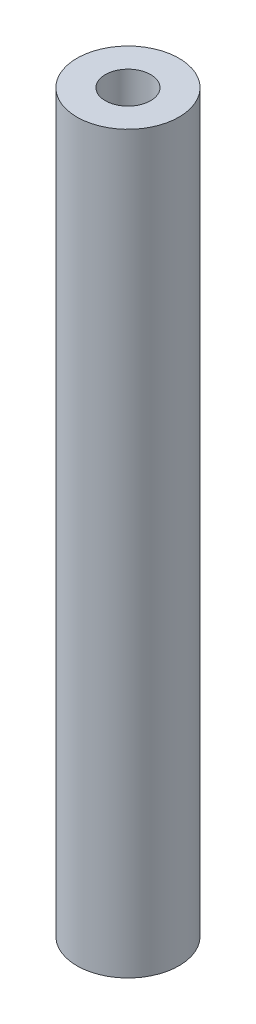
ISO-10303-21;
HEADER;
FILE_DESCRIPTION(('STEP AP214'),'2;1');
FILE_NAME('part.step','',(''),(''),'','','');
FILE_SCHEMA(('AUTOMOTIVE_DESIGN { 1 0 10303 214 1 1 1 1 }'));
ENDSEC;
DATA;
#1=APPLICATION_CONTEXT('core data for automotive mechanical design processes');
#2=APPLICATION_PROTOCOL_DEFINITION('international standard','automotive_design',2000,#1);
#3=PRODUCT_CONTEXT('',#1,'mechanical');
#4=PRODUCT('Part','Part','',(#3));
#5=PRODUCT_RELATED_PRODUCT_CATEGORY('part','',(#4));
#6=PRODUCT_DEFINITION_FORMATION('','',#4);
#7=PRODUCT_DEFINITION_CONTEXT('part definition',#1,'design');
#8=PRODUCT_DEFINITION('design','',#6,#7);
#9=PRODUCT_DEFINITION_SHAPE('','',#8);
#10=(LENGTH_UNIT() NAMED_UNIT(*) SI_UNIT(.MILLI.,.METRE.));
#11=(NAMED_UNIT(*) PLANE_ANGLE_UNIT() SI_UNIT($,.RADIAN.));
#12=(NAMED_UNIT(*) SI_UNIT($,.STERADIAN.) SOLID_ANGLE_UNIT());
#13=UNCERTAINTY_MEASURE_WITH_UNIT(LENGTH_MEASURE(1.E-05),#10,'distance_accuracy_value','');
#14=(GEOMETRIC_REPRESENTATION_CONTEXT(3) GLOBAL_UNCERTAINTY_ASSIGNED_CONTEXT((#13)) GLOBAL_UNIT_ASSIGNED_CONTEXT((#10,
#11,#12)) REPRESENTATION_CONTEXT('',''));
#15=CARTESIAN_POINT('',(0.,0.,0.));
#16=DIRECTION('',(0.,0.,1.));
#17=DIRECTION('',(1.,0.,0.));
#18=AXIS2_PLACEMENT_3D('',#15,#16,#17);
#19=CARTESIAN_POINT('',(0.,38.9,0.));
#20=DIRECTION('',(0.,1.,0.));
#21=DIRECTION('',(0.,0.,1.));
#22=AXIS2_PLACEMENT_3D('',#19,#20,#21);
#23=PLANE('',#22);
#24=CARTESIAN_POINT('',(0.,38.9,0.));
#25=DIRECTION('',(0.,1.,0.));
#26=DIRECTION('',(0.,0.,1.));
#27=AXIS2_PLACEMENT_3D('',#24,#25,#26);
#28=CIRCLE('',#27,2.7);
#29=CARTESIAN_POINT('',(0.,38.9,2.7));
#30=VERTEX_POINT('',#29);
#31=EDGE_CURVE('E10',#30,#30,#28,.T.);
#32=ORIENTED_EDGE('',*,*,#31,.T.);
#33=EDGE_LOOP('',(#32));
#34=FACE_BOUND('',#33,.T.);
#35=CARTESIAN_POINT('',(0.,38.9,0.));
#36=DIRECTION('',(0.,1.,0.));
#37=DIRECTION('',(0.,0.,1.));
#38=AXIS2_PLACEMENT_3D('',#35,#36,#37);
#39=CIRCLE('',#38,1.2);
#40=CARTESIAN_POINT('',(0.,38.9,1.2));
#41=VERTEX_POINT('',#40);
#42=EDGE_CURVE('E50',#41,#41,#39,.T.);
#43=ORIENTED_EDGE('',*,*,#42,.F.);
#44=EDGE_LOOP('',(#43));
#45=FACE_BOUND('',#44,.T.);
#46=ADVANCED_FACE('F37',(#34,#45),#23,.T.);
#47=CARTESIAN_POINT('',(0.,0.,0.));
#48=DIRECTION('',(0.,1.,0.));
#49=DIRECTION('',(0.,0.,1.));
#50=AXIS2_PLACEMENT_3D('',#47,#48,#49);
#51=PLANE('',#50);
#52=CARTESIAN_POINT('',(0.,0.,0.));
#53=DIRECTION('',(0.,1.,0.));
#54=DIRECTION('',(0.,0.,1.));
#55=AXIS2_PLACEMENT_3D('',#52,#53,#54);
#56=CIRCLE('',#55,2.7);
#57=CARTESIAN_POINT('',(0.,0.,2.7));
#58=VERTEX_POINT('',#57);
#59=EDGE_CURVE('E41',#58,#58,#56,.T.);
#60=ORIENTED_EDGE('',*,*,#59,.F.);
#61=EDGE_LOOP('',(#60));
#62=FACE_BOUND('',#61,.T.);
#63=CARTESIAN_POINT('',(0.,0.,0.));
#64=DIRECTION('',(0.,1.,0.));
#65=DIRECTION('',(0.,0.,1.));
#66=AXIS2_PLACEMENT_3D('',#63,#64,#65);
#67=CIRCLE('',#66,1.2);
#68=CARTESIAN_POINT('',(0.,0.,1.2));
#69=VERTEX_POINT('',#68);
#70=EDGE_CURVE('E52',#69,#69,#67,.T.);
#71=ORIENTED_EDGE('',*,*,#70,.T.);
#72=EDGE_LOOP('',(#71));
#73=FACE_BOUND('',#72,.T.);
#74=ADVANCED_FACE('F64',(#62,#73),#51,.F.);
#75=CARTESIAN_POINT('',(0.,38.9,0.));
#76=DIRECTION('',(0.,-1.,0.));
#77=DIRECTION('',(0.,0.,-1.));
#78=AXIS2_PLACEMENT_3D('',#75,#76,#77);
#79=CYLINDRICAL_SURFACE('',#78,2.7);
#80=ORIENTED_EDGE('',*,*,#31,.F.);
#81=EDGE_LOOP('',(#80));
#82=FACE_BOUND('',#81,.T.);
#83=ORIENTED_EDGE('',*,*,#59,.T.);
#84=EDGE_LOOP('',(#83));
#85=FACE_BOUND('',#84,.T.);
#86=ADVANCED_FACE('F39',(#82,#85),#79,.T.);
#87=CARTESIAN_POINT('',(0.,38.9,0.));
#88=DIRECTION('',(0.,-1.,0.));
#89=DIRECTION('',(0.,0.,-1.));
#90=AXIS2_PLACEMENT_3D('',#87,#88,#89);
#91=CYLINDRICAL_SURFACE('',#90,1.2);
#92=ORIENTED_EDGE('',*,*,#42,.T.);
#93=EDGE_LOOP('',(#92));
#94=FACE_BOUND('',#93,.T.);
#95=ORIENTED_EDGE('',*,*,#70,.F.);
#96=EDGE_LOOP('',(#95));
#97=FACE_BOUND('',#96,.T.);
#98=ADVANCED_FACE('F60',(#94,#97),#91,.F.);
#99=CLOSED_SHELL('',(#46,#74,#86,#98));
#100=MANIFOLD_SOLID_BREP('B2',#99);
#101=ADVANCED_BREP_SHAPE_REPRESENTATION('',(#18,#100),#14);
#102=SHAPE_DEFINITION_REPRESENTATION(#9,#101);
ENDSEC;
END-ISO-10303-21;
